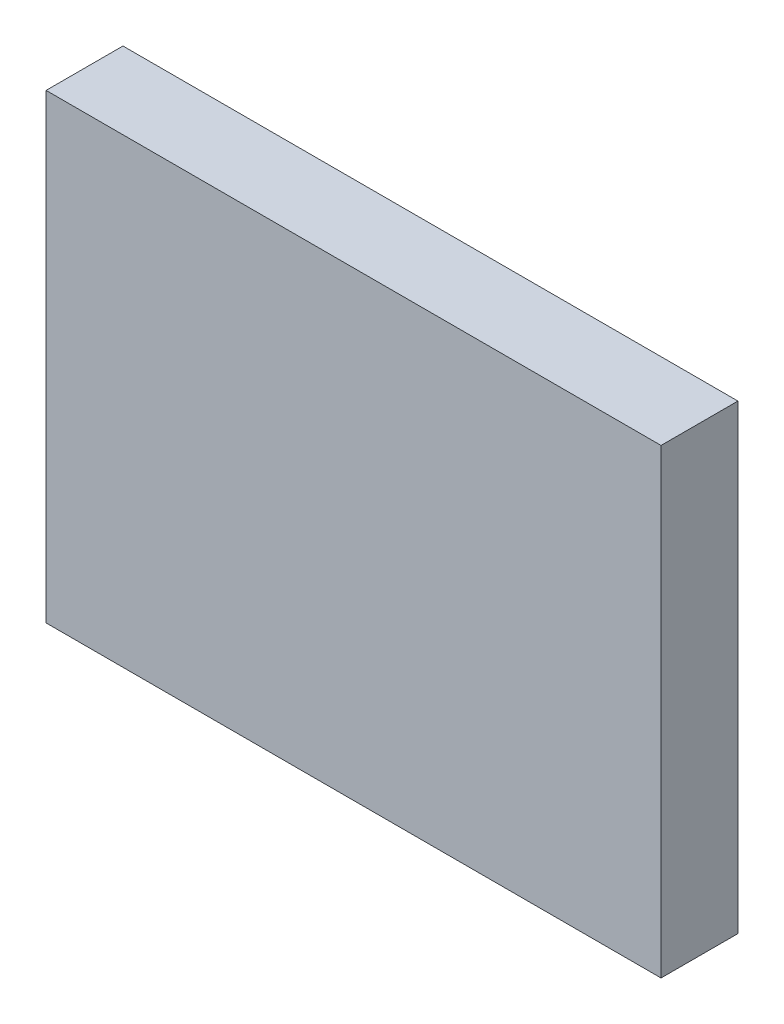
ISO-10303-21;
HEADER;
FILE_DESCRIPTION(('STEP AP214'),'2;1');
FILE_NAME('part.step','',(''),(''),'','','');
FILE_SCHEMA(('AUTOMOTIVE_DESIGN { 1 0 10303 214 1 1 1 1 }'));
ENDSEC;
DATA;
#1=APPLICATION_CONTEXT('core data for automotive mechanical design processes');
#2=APPLICATION_PROTOCOL_DEFINITION('international standard','automotive_design',2000,#1);
#3=PRODUCT_CONTEXT('',#1,'mechanical');
#4=PRODUCT('Part','Part','',(#3));
#5=PRODUCT_RELATED_PRODUCT_CATEGORY('part','',(#4));
#6=PRODUCT_DEFINITION_FORMATION('','',#4);
#7=PRODUCT_DEFINITION_CONTEXT('part definition',#1,'design');
#8=PRODUCT_DEFINITION('design','',#6,#7);
#9=PRODUCT_DEFINITION_SHAPE('','',#8);
#10=(LENGTH_UNIT() NAMED_UNIT(*) SI_UNIT(.MILLI.,.METRE.));
#11=(NAMED_UNIT(*) PLANE_ANGLE_UNIT() SI_UNIT($,.RADIAN.));
#12=(NAMED_UNIT(*) SI_UNIT($,.STERADIAN.) SOLID_ANGLE_UNIT());
#13=UNCERTAINTY_MEASURE_WITH_UNIT(LENGTH_MEASURE(1.E-05),#10,'distance_accuracy_value','');
#14=(GEOMETRIC_REPRESENTATION_CONTEXT(3) GLOBAL_UNCERTAINTY_ASSIGNED_CONTEXT((#13)) GLOBAL_UNIT_ASSIGNED_CONTEXT((#10,
#11,#12)) REPRESENTATION_CONTEXT('',''));
#15=CARTESIAN_POINT('',(0.,0.,0.));
#16=DIRECTION('',(0.,0.,1.));
#17=DIRECTION('',(1.,0.,0.));
#18=AXIS2_PLACEMENT_3D('',#15,#16,#17);
#19=CARTESIAN_POINT('',(0.,0.,12.7));
#20=DIRECTION('',(1.,0.,0.));
#21=DIRECTION('',(0.,0.,-1.));
#22=AXIS2_PLACEMENT_3D('',#19,#20,#21);
#23=PLANE('',#22);
#24=DIRECTION('',(0.,-1.,0.));
#25=VECTOR('',#24,1.);
#26=CARTESIAN_POINT('',(0.,0.,0.));
#27=LINE('',#26,#25);
#28=CARTESIAN_POINT('',(0.,76.2,0.));
#29=VERTEX_POINT('',#28);
#30=CARTESIAN_POINT('',(0.,0.,0.));
#31=VERTEX_POINT('',#30);
#32=EDGE_CURVE('E105',#29,#31,#27,.T.);
#33=ORIENTED_EDGE('',*,*,#32,.T.);
#34=DIRECTION('',(0.,0.,-1.));
#35=VECTOR('',#34,1.);
#36=CARTESIAN_POINT('',(0.,0.,12.7));
#37=LINE('',#36,#35);
#38=CARTESIAN_POINT('',(0.,0.,12.7));
#39=VERTEX_POINT('',#38);
#40=EDGE_CURVE('E11',#39,#31,#37,.T.);
#41=ORIENTED_EDGE('',*,*,#40,.F.);
#42=DIRECTION('',(0.,-1.,0.));
#43=VECTOR('',#42,1.);
#44=CARTESIAN_POINT('',(0.,0.,12.7));
#45=LINE('',#44,#43);
#46=CARTESIAN_POINT('',(0.,76.2,12.7));
#47=VERTEX_POINT('',#46);
#48=EDGE_CURVE('E89',#47,#39,#45,.T.);
#49=ORIENTED_EDGE('',*,*,#48,.F.);
#50=DIRECTION('',(0.,0.,-1.));
#51=VECTOR('',#50,1.);
#52=CARTESIAN_POINT('',(0.,76.2,12.7));
#53=LINE('',#52,#51);
#54=EDGE_CURVE('E98',#47,#29,#53,.T.);
#55=ORIENTED_EDGE('',*,*,#54,.T.);
#56=EDGE_LOOP('',(#33,#41,#49,#55));
#57=FACE_BOUND('',#56,.T.);
#58=ADVANCED_FACE('F39',(#57),#23,.F.);
#59=CARTESIAN_POINT('',(0.,0.,12.7));
#60=DIRECTION('',(0.,1.,0.));
#61=DIRECTION('',(0.,0.,1.));
#62=AXIS2_PLACEMENT_3D('',#59,#60,#61);
#63=PLANE('',#62);
#64=DIRECTION('',(1.,0.,0.));
#65=VECTOR('',#64,1.);
#66=CARTESIAN_POINT('',(0.,0.,0.));
#67=LINE('',#66,#65);
#68=CARTESIAN_POINT('',(101.6,0.,0.));
#69=VERTEX_POINT('',#68);
#70=EDGE_CURVE('E94',#31,#69,#67,.T.);
#71=ORIENTED_EDGE('',*,*,#70,.T.);
#72=DIRECTION('',(0.,0.,-1.));
#73=VECTOR('',#72,1.);
#74=CARTESIAN_POINT('',(101.6,0.,12.7));
#75=LINE('',#74,#73);
#76=CARTESIAN_POINT('',(101.6,0.,12.7));
#77=VERTEX_POINT('',#76);
#78=EDGE_CURVE('E50',#77,#69,#75,.T.);
#79=ORIENTED_EDGE('',*,*,#78,.F.);
#80=DIRECTION('',(1.,0.,0.));
#81=VECTOR('',#80,1.);
#82=CARTESIAN_POINT('',(0.,0.,12.7));
#83=LINE('',#82,#81);
#84=EDGE_CURVE('E83',#39,#77,#83,.T.);
#85=ORIENTED_EDGE('',*,*,#84,.F.);
#86=ORIENTED_EDGE('',*,*,#40,.T.);
#87=EDGE_LOOP('',(#71,#79,#85,#86));
#88=FACE_BOUND('',#87,.T.);
#89=ADVANCED_FACE('F91',(#88),#63,.F.);
#90=CARTESIAN_POINT('',(101.6,0.,12.7));
#91=DIRECTION('',(-1.,0.,0.));
#92=DIRECTION('',(0.,0.,1.));
#93=AXIS2_PLACEMENT_3D('',#90,#91,#92);
#94=PLANE('',#93);
#95=DIRECTION('',(0.,1.,0.));
#96=VECTOR('',#95,1.);
#97=CARTESIAN_POINT('',(101.6,0.,0.));
#98=LINE('',#97,#96);
#99=CARTESIAN_POINT('',(101.6,76.2,0.));
#100=VERTEX_POINT('',#99);
#101=EDGE_CURVE('E75',#69,#100,#98,.T.);
#102=ORIENTED_EDGE('',*,*,#101,.T.);
#103=DIRECTION('',(0.,0.,-1.));
#104=VECTOR('',#103,1.);
#105=CARTESIAN_POINT('',(101.6,76.2,12.7));
#106=LINE('',#105,#104);
#107=CARTESIAN_POINT('',(101.6,76.2,12.7));
#108=VERTEX_POINT('',#107);
#109=EDGE_CURVE('E92',#108,#100,#106,.T.);
#110=ORIENTED_EDGE('',*,*,#109,.F.);
#111=DIRECTION('',(0.,1.,0.));
#112=VECTOR('',#111,1.);
#113=CARTESIAN_POINT('',(101.6,0.,12.7));
#114=LINE('',#113,#112);
#115=EDGE_CURVE('E86',#77,#108,#114,.T.);
#116=ORIENTED_EDGE('',*,*,#115,.F.);
#117=ORIENTED_EDGE('',*,*,#78,.T.);
#118=EDGE_LOOP('',(#102,#110,#116,#117));
#119=FACE_BOUND('',#118,.T.);
#120=ADVANCED_FACE('F96',(#119),#94,.F.);
#121=CARTESIAN_POINT('',(0.,76.2,12.7));
#122=DIRECTION('',(0.,-1.,0.));
#123=DIRECTION('',(0.,0.,-1.));
#124=AXIS2_PLACEMENT_3D('',#121,#122,#123);
#125=PLANE('',#124);
#126=DIRECTION('',(-1.,0.,0.));
#127=VECTOR('',#126,1.);
#128=CARTESIAN_POINT('',(0.,76.2,0.));
#129=LINE('',#128,#127);
#130=EDGE_CURVE('E79',#100,#29,#129,.T.);
#131=ORIENTED_EDGE('',*,*,#130,.T.);
#132=ORIENTED_EDGE('',*,*,#54,.F.);
#133=DIRECTION('',(-1.,0.,0.));
#134=VECTOR('',#133,1.);
#135=CARTESIAN_POINT('',(0.,76.2,12.7));
#136=LINE('',#135,#134);
#137=EDGE_CURVE('E54',#108,#47,#136,.T.);
#138=ORIENTED_EDGE('',*,*,#137,.F.);
#139=ORIENTED_EDGE('',*,*,#109,.T.);
#140=EDGE_LOOP('',(#131,#132,#138,#139));
#141=FACE_BOUND('',#140,.T.);
#142=ADVANCED_FACE('F108',(#141),#125,.F.);
#143=CARTESIAN_POINT('',(0.,0.,12.7));
#144=DIRECTION('',(0.,0.,-1.));
#145=DIRECTION('',(-1.,0.,0.));
#146=AXIS2_PLACEMENT_3D('',#143,#144,#145);
#147=PLANE('',#146);
#148=ORIENTED_EDGE('',*,*,#48,.T.);
#149=ORIENTED_EDGE('',*,*,#84,.T.);
#150=ORIENTED_EDGE('',*,*,#115,.T.);
#151=ORIENTED_EDGE('',*,*,#137,.T.);
#152=EDGE_LOOP('',(#148,#149,#150,#151));
#153=FACE_BOUND('',#152,.T.);
#154=ADVANCED_FACE('F88',(#153),#147,.F.);
#155=CARTESIAN_POINT('',(0.,0.,0.));
#156=DIRECTION('',(0.,0.,-1.));
#157=DIRECTION('',(-1.,0.,0.));
#158=AXIS2_PLACEMENT_3D('',#155,#156,#157);
#159=PLANE('',#158);
#160=ORIENTED_EDGE('',*,*,#32,.F.);
#161=ORIENTED_EDGE('',*,*,#130,.F.);
#162=ORIENTED_EDGE('',*,*,#101,.F.);
#163=ORIENTED_EDGE('',*,*,#70,.F.);
#164=EDGE_LOOP('',(#160,#161,#162,#163));
#165=FACE_BOUND('',#164,.T.);
#166=ADVANCED_FACE('F115',(#165),#159,.T.);
#167=CLOSED_SHELL('',(#58,#89,#120,#142,#154,#166));
#168=MANIFOLD_SOLID_BREP('B2',#167);
#169=ADVANCED_BREP_SHAPE_REPRESENTATION('',(#18,#168),#14);
#170=SHAPE_DEFINITION_REPRESENTATION(#9,#169);
ENDSEC;
END-ISO-10303-21;
